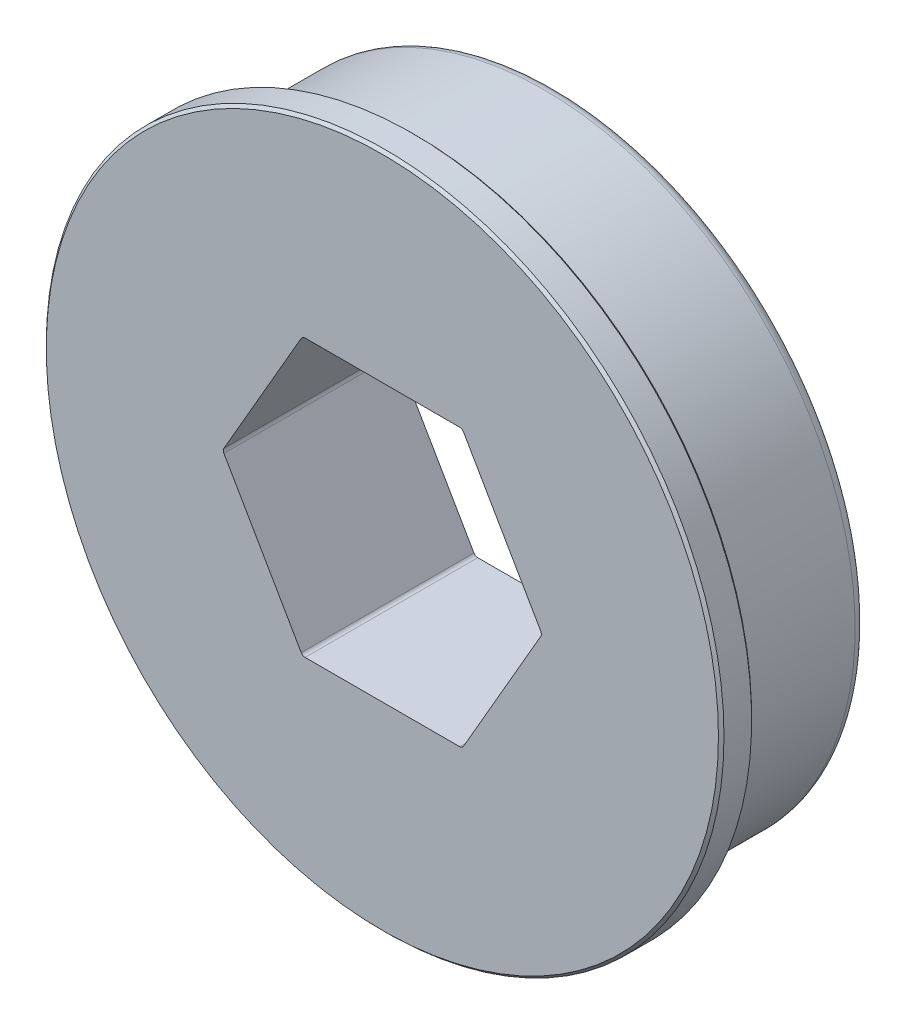
ISO-10303-21;
HEADER;
FILE_DESCRIPTION(('STEP AP214'),'2;1');
FILE_NAME('part.step','',(''),(''),'','','');
FILE_SCHEMA(('AUTOMOTIVE_DESIGN { 1 0 10303 214 1 1 1 1 }'));
ENDSEC;
DATA;
#1=APPLICATION_CONTEXT('core data for automotive mechanical design processes');
#2=APPLICATION_PROTOCOL_DEFINITION('international standard','automotive_design',2000,#1);
#3=PRODUCT_CONTEXT('',#1,'mechanical');
#4=PRODUCT('Part','Part','',(#3));
#5=PRODUCT_RELATED_PRODUCT_CATEGORY('part','',(#4));
#6=PRODUCT_DEFINITION_FORMATION('','',#4);
#7=PRODUCT_DEFINITION_CONTEXT('part definition',#1,'design');
#8=PRODUCT_DEFINITION('design','',#6,#7);
#9=PRODUCT_DEFINITION_SHAPE('','',#8);
#10=(LENGTH_UNIT() NAMED_UNIT(*) SI_UNIT(.MILLI.,.METRE.));
#11=(NAMED_UNIT(*) PLANE_ANGLE_UNIT() SI_UNIT($,.RADIAN.));
#12=(NAMED_UNIT(*) SI_UNIT($,.STERADIAN.) SOLID_ANGLE_UNIT());
#13=UNCERTAINTY_MEASURE_WITH_UNIT(LENGTH_MEASURE(1.E-05),#10,'distance_accuracy_value','');
#14=(GEOMETRIC_REPRESENTATION_CONTEXT(3) GLOBAL_UNCERTAINTY_ASSIGNED_CONTEXT((#13)) GLOBAL_UNIT_ASSIGNED_CONTEXT((#10,
#11,#12)) REPRESENTATION_CONTEXT('',''));
#15=CARTESIAN_POINT('',(0.,0.,0.));
#16=DIRECTION('',(0.,0.,1.));
#17=DIRECTION('',(1.,0.,0.));
#18=AXIS2_PLACEMENT_3D('',#15,#16,#17);
#19=CARTESIAN_POINT('',(0.,0.,7.92734));
#20=DIRECTION('',(0.,0.,-1.));
#21=DIRECTION('',(-1.,0.,0.));
#22=AXIS2_PLACEMENT_3D('',#19,#20,#21);
#23=CYLINDRICAL_SURFACE('',#22,15.5575);
#24=CARTESIAN_POINT('',(0.,0.,7.80034));
#25=DIRECTION('',(0.,0.,1.));
#26=DIRECTION('',(1.,0.,0.));
#27=AXIS2_PLACEMENT_3D('',#24,#25,#26);
#28=CIRCLE('',#27,15.5575);
#29=CARTESIAN_POINT('',(15.5575,0.,7.80034));
#30=VERTEX_POINT('',#29);
#31=EDGE_CURVE('E196',#30,#30,#28,.F.);
#32=ORIENTED_EDGE('',*,*,#31,.T.);
#33=EDGE_LOOP('',(#32));
#34=FACE_BOUND('',#33,.T.);
#35=CARTESIAN_POINT('',(0.,0.,6.53034000000001));
#36=DIRECTION('',(0.,0.,-1.));
#37=DIRECTION('',(-1.,0.,0.));
#38=AXIS2_PLACEMENT_3D('',#35,#36,#37);
#39=CIRCLE('',#38,15.5575);
#40=CARTESIAN_POINT('',(-15.5575,0.,6.53034000000001));
#41=VERTEX_POINT('',#40);
#42=EDGE_CURVE('E193',#41,#41,#39,.F.);
#43=ORIENTED_EDGE('',*,*,#42,.T.);
#44=EDGE_LOOP('',(#43));
#45=FACE_BOUND('',#44,.T.);
#46=ADVANCED_FACE('F46',(#34,#45),#23,.T.);
#47=CARTESIAN_POINT('',(15.5575,0.,7.92734));
#48=DIRECTION('',(0.,0.,1.));
#49=DIRECTION('',(1.,0.,0.));
#50=AXIS2_PLACEMENT_3D('',#47,#48,#49);
#51=PLANE('',#50);
#52=CARTESIAN_POINT('',(0.,0.,7.92734));
#53=DIRECTION('',(0.,0.,1.));
#54=DIRECTION('',(1.,0.,0.));
#55=AXIS2_PLACEMENT_3D('',#52,#53,#54);
#56=CIRCLE('',#55,15.4305);
#57=CARTESIAN_POINT('',(15.4305,0.,7.92734));
#58=VERTEX_POINT('',#57);
#59=EDGE_CURVE('E199',#58,#58,#56,.T.);
#60=ORIENTED_EDGE('',*,*,#59,.T.);
#61=EDGE_LOOP('',(#60));
#62=FACE_BOUND('',#61,.T.);
#63=DIRECTION('',(-0.5,0.866025403784438,0.));
#64=VECTOR('',#63,1.);
#65=CARTESIAN_POINT('',(-3.66617420935411,-6.35000000000001,7.92734));
#66=LINE('',#65,#64);
#67=CARTESIAN_POINT('',(-3.72483299670378,-6.24840000000001,7.92734));
#68=VERTEX_POINT('',#67);
#69=CARTESIAN_POINT('',(-7.27368963135857,-0.101600000000006,7.92734));
#70=VERTEX_POINT('',#69);
#71=EDGE_CURVE('E184',#68,#70,#66,.T.);
#72=ORIENTED_EDGE('',*,*,#71,.T.);
#73=CARTESIAN_POINT('',(-7.09771326930958,0.,7.92734));
#74=DIRECTION('',(0.,0.,1.));
#75=DIRECTION('',(1.,0.,0.));
#76=AXIS2_PLACEMENT_3D('',#73,#74,#75);
#77=CIRCLE('',#76,0.2032);
#78=CARTESIAN_POINT('',(-7.27368963135857,0.101599999999993,7.92734));
#79=VERTEX_POINT('',#78);
#80=EDGE_CURVE('E68',#70,#79,#77,.F.);
#81=ORIENTED_EDGE('',*,*,#80,.T.);
#82=DIRECTION('',(0.5,0.866025403784439,0.));
#83=VECTOR('',#82,1.);
#84=CARTESIAN_POINT('',(-7.33234841870824,0.,7.92734));
#85=LINE('',#84,#83);
#86=CARTESIAN_POINT('',(-3.72483299670379,6.24839999999999,7.92734));
#87=VERTEX_POINT('',#86);
#88=EDGE_CURVE('E179',#79,#87,#85,.T.);
#89=ORIENTED_EDGE('',*,*,#88,.T.);
#90=CARTESIAN_POINT('',(-3.54885663465479,6.14679999999999,7.92734));
#91=DIRECTION('',(0.,0.,1.));
#92=DIRECTION('',(1.,0.,0.));
#93=AXIS2_PLACEMENT_3D('',#90,#91,#92);
#94=CIRCLE('',#93,0.2032);
#95=CARTESIAN_POINT('',(-3.54885663465479,6.34999999999999,7.92734));
#96=VERTEX_POINT('',#95);
#97=EDGE_CURVE('E13',#87,#96,#94,.F.);
#98=ORIENTED_EDGE('',*,*,#97,.T.);
#99=DIRECTION('',(1.,0.,0.));
#100=VECTOR('',#99,1.);
#101=CARTESIAN_POINT('',(-3.66617420935412,6.34999999999999,7.92734));
#102=LINE('',#101,#100);
#103=CARTESIAN_POINT('',(3.5488566346548,6.35,7.92734));
#104=VERTEX_POINT('',#103);
#105=EDGE_CURVE('E252',#96,#104,#102,.T.);
#106=ORIENTED_EDGE('',*,*,#105,.T.);
#107=CARTESIAN_POINT('',(3.5488566346548,6.1468,7.92734));
#108=DIRECTION('',(0.,0.,1.));
#109=DIRECTION('',(1.,0.,0.));
#110=AXIS2_PLACEMENT_3D('',#107,#108,#109);
#111=CIRCLE('',#110,0.2032);
#112=CARTESIAN_POINT('',(3.72483299670379,6.2484,7.92734));
#113=VERTEX_POINT('',#112);
#114=EDGE_CURVE('E146',#104,#113,#111,.F.);
#115=ORIENTED_EDGE('',*,*,#114,.T.);
#116=DIRECTION('',(0.5,-0.866025403784438,0.));
#117=VECTOR('',#116,1.);
#118=CARTESIAN_POINT('',(3.66617420935413,6.35,7.92734));
#119=LINE('',#118,#117);
#120=CARTESIAN_POINT('',(7.27368963135859,0.101599999999997,7.92734));
#121=VERTEX_POINT('',#120);
#122=EDGE_CURVE('E156',#113,#121,#119,.T.);
#123=ORIENTED_EDGE('',*,*,#122,.T.);
#124=CARTESIAN_POINT('',(7.09771326930959,0.,7.92734));
#125=DIRECTION('',(0.,0.,1.));
#126=DIRECTION('',(1.,0.,0.));
#127=AXIS2_PLACEMENT_3D('',#124,#125,#126);
#128=CIRCLE('',#127,0.2032);
#129=CARTESIAN_POINT('',(7.27368963135859,-0.101600000000005,7.92734));
#130=VERTEX_POINT('',#129);
#131=EDGE_CURVE('E232',#121,#130,#128,.F.);
#132=ORIENTED_EDGE('',*,*,#131,.T.);
#133=DIRECTION('',(-0.5,-0.866025403784439,0.));
#134=VECTOR('',#133,1.);
#135=CARTESIAN_POINT('',(7.33234841870825,0.,7.92734));
#136=LINE('',#135,#134);
#137=CARTESIAN_POINT('',(3.7248329967038,-6.24840000000001,7.92734));
#138=VERTEX_POINT('',#137);
#139=EDGE_CURVE('E256',#130,#138,#136,.T.);
#140=ORIENTED_EDGE('',*,*,#139,.T.);
#141=CARTESIAN_POINT('',(3.5488566346548,-6.14680000000001,7.92734));
#142=DIRECTION('',(0.,0.,1.));
#143=DIRECTION('',(1.,0.,0.));
#144=AXIS2_PLACEMENT_3D('',#141,#142,#143);
#145=CIRCLE('',#144,0.2032);
#146=CARTESIAN_POINT('',(3.5488566346548,-6.35000000000001,7.92734));
#147=VERTEX_POINT('',#146);
#148=EDGE_CURVE('E236',#138,#147,#145,.F.);
#149=ORIENTED_EDGE('',*,*,#148,.T.);
#150=DIRECTION('',(-1.,0.,0.));
#151=VECTOR('',#150,1.);
#152=CARTESIAN_POINT('',(3.66617420935413,-6.35000000000001,7.92734));
#153=LINE('',#152,#151);
#154=CARTESIAN_POINT('',(-3.54885663465478,-6.35000000000001,7.92734));
#155=VERTEX_POINT('',#154);
#156=EDGE_CURVE('E262',#147,#155,#153,.T.);
#157=ORIENTED_EDGE('',*,*,#156,.T.);
#158=CARTESIAN_POINT('',(-3.54885663465478,-6.14680000000001,7.92734));
#159=DIRECTION('',(0.,0.,1.));
#160=DIRECTION('',(1.,0.,0.));
#161=AXIS2_PLACEMENT_3D('',#158,#159,#160);
#162=CIRCLE('',#161,0.2032);
#163=EDGE_CURVE('E240',#155,#68,#162,.F.);
#164=ORIENTED_EDGE('',*,*,#163,.T.);
#165=EDGE_LOOP('',(#72,#81,#89,#98,#106,#115,#123,#132,#140,#149,#157,#164));
#166=FACE_BOUND('',#165,.T.);
#167=ADVANCED_FACE('F251',(#62,#166),#51,.T.);
#168=CARTESIAN_POINT('',(0.,0.,0.));
#169=DIRECTION('',(0.,0.,-1.));
#170=DIRECTION('',(-1.,0.,0.));
#171=AXIS2_PLACEMENT_3D('',#168,#169,#170);
#172=PLANE('',#171);
#173=CARTESIAN_POINT('',(0.,0.,0.));
#174=DIRECTION('',(0.,0.,-1.));
#175=DIRECTION('',(-1.,0.,0.));
#176=AXIS2_PLACEMENT_3D('',#173,#174,#175);
#177=CIRCLE('',#176,13.7795);
#178=CARTESIAN_POINT('',(-13.7795,0.,0.));
#179=VERTEX_POINT('',#178);
#180=EDGE_CURVE('E202',#179,#179,#177,.T.);
#181=ORIENTED_EDGE('',*,*,#180,.T.);
#182=EDGE_LOOP('',(#181));
#183=FACE_BOUND('',#182,.T.);
#184=DIRECTION('',(0.5,0.866025403784439,0.));
#185=VECTOR('',#184,1.);
#186=CARTESIAN_POINT('',(-7.33234841870824,0.,0.));
#187=LINE('',#186,#185);
#188=CARTESIAN_POINT('',(-7.27368963135857,0.101599999999993,0.));
#189=VERTEX_POINT('',#188);
#190=CARTESIAN_POINT('',(-3.72483299670379,6.24839999999999,0.));
#191=VERTEX_POINT('',#190);
#192=EDGE_CURVE('E170',#189,#191,#187,.T.);
#193=ORIENTED_EDGE('',*,*,#192,.F.);
#194=CARTESIAN_POINT('',(-7.09771326930958,0.,0.));
#195=DIRECTION('',(0.,0.,-1.));
#196=DIRECTION('',(-1.,0.,0.));
#197=AXIS2_PLACEMENT_3D('',#194,#195,#196);
#198=CIRCLE('',#197,0.2032);
#199=CARTESIAN_POINT('',(-7.27368963135857,-0.101600000000006,0.));
#200=VERTEX_POINT('',#199);
#201=EDGE_CURVE('E242',#189,#200,#198,.F.);
#202=ORIENTED_EDGE('',*,*,#201,.T.);
#203=DIRECTION('',(-0.5,0.866025403784438,0.));
#204=VECTOR('',#203,1.);
#205=CARTESIAN_POINT('',(-3.66617420935411,-6.35000000000001,0.));
#206=LINE('',#205,#204);
#207=CARTESIAN_POINT('',(-3.72483299670378,-6.24840000000001,0.));
#208=VERTEX_POINT('',#207);
#209=EDGE_CURVE('E176',#208,#200,#206,.T.);
#210=ORIENTED_EDGE('',*,*,#209,.F.);
#211=CARTESIAN_POINT('',(-3.54885663465478,-6.14680000000001,0.));
#212=DIRECTION('',(0.,0.,-1.));
#213=DIRECTION('',(-1.,0.,0.));
#214=AXIS2_PLACEMENT_3D('',#211,#212,#213);
#215=CIRCLE('',#214,0.2032);
#216=CARTESIAN_POINT('',(-3.54885663465478,-6.35000000000001,0.));
#217=VERTEX_POINT('',#216);
#218=EDGE_CURVE('E238',#208,#217,#215,.F.);
#219=ORIENTED_EDGE('',*,*,#218,.T.);
#220=DIRECTION('',(-1.,0.,0.));
#221=VECTOR('',#220,1.);
#222=CARTESIAN_POINT('',(3.66617420935413,-6.35000000000001,0.));
#223=LINE('',#222,#221);
#224=CARTESIAN_POINT('',(3.5488566346548,-6.35000000000001,0.));
#225=VERTEX_POINT('',#224);
#226=EDGE_CURVE('E168',#225,#217,#223,.T.);
#227=ORIENTED_EDGE('',*,*,#226,.F.);
#228=CARTESIAN_POINT('',(3.5488566346548,-6.14680000000001,0.));
#229=DIRECTION('',(0.,0.,-1.));
#230=DIRECTION('',(-1.,0.,0.));
#231=AXIS2_PLACEMENT_3D('',#228,#229,#230);
#232=CIRCLE('',#231,0.2032);
#233=CARTESIAN_POINT('',(3.7248329967038,-6.24840000000001,0.));
#234=VERTEX_POINT('',#233);
#235=EDGE_CURVE('E234',#225,#234,#232,.F.);
#236=ORIENTED_EDGE('',*,*,#235,.T.);
#237=DIRECTION('',(-0.5,-0.866025403784439,0.));
#238=VECTOR('',#237,1.);
#239=CARTESIAN_POINT('',(7.33234841870825,0.,0.));
#240=LINE('',#239,#238);
#241=CARTESIAN_POINT('',(7.27368963135859,-0.101600000000005,0.));
#242=VERTEX_POINT('',#241);
#243=EDGE_CURVE('E164',#242,#234,#240,.T.);
#244=ORIENTED_EDGE('',*,*,#243,.F.);
#245=CARTESIAN_POINT('',(7.09771326930959,0.,0.));
#246=DIRECTION('',(0.,0.,-1.));
#247=DIRECTION('',(-1.,0.,0.));
#248=AXIS2_PLACEMENT_3D('',#245,#246,#247);
#249=CIRCLE('',#248,0.2032);
#250=CARTESIAN_POINT('',(7.27368963135859,0.101599999999997,0.));
#251=VERTEX_POINT('',#250);
#252=EDGE_CURVE('E163',#242,#251,#249,.F.);
#253=ORIENTED_EDGE('',*,*,#252,.T.);
#254=DIRECTION('',(0.5,-0.866025403784438,0.));
#255=VECTOR('',#254,1.);
#256=CARTESIAN_POINT('',(3.66617420935413,6.35,0.));
#257=LINE('',#256,#255);
#258=CARTESIAN_POINT('',(3.72483299670379,6.2484,0.));
#259=VERTEX_POINT('',#258);
#260=EDGE_CURVE('E153',#259,#251,#257,.T.);
#261=ORIENTED_EDGE('',*,*,#260,.F.);
#262=CARTESIAN_POINT('',(3.5488566346548,6.1468,0.));
#263=DIRECTION('',(0.,0.,-1.));
#264=DIRECTION('',(-1.,0.,0.));
#265=AXIS2_PLACEMENT_3D('',#262,#263,#264);
#266=CIRCLE('',#265,0.2032);
#267=CARTESIAN_POINT('',(3.5488566346548,6.35,0.));
#268=VERTEX_POINT('',#267);
#269=EDGE_CURVE('E136',#259,#268,#266,.F.);
#270=ORIENTED_EDGE('',*,*,#269,.T.);
#271=DIRECTION('',(1.,0.,0.));
#272=VECTOR('',#271,1.);
#273=CARTESIAN_POINT('',(-3.66617420935412,6.34999999999999,0.));
#274=LINE('',#273,#272);
#275=CARTESIAN_POINT('',(-3.54885663465479,6.34999999999999,0.));
#276=VERTEX_POINT('',#275);
#277=EDGE_CURVE('E165',#276,#268,#274,.T.);
#278=ORIENTED_EDGE('',*,*,#277,.F.);
#279=CARTESIAN_POINT('',(-3.54885663465479,6.14679999999999,0.));
#280=DIRECTION('',(0.,0.,-1.));
#281=DIRECTION('',(-1.,0.,0.));
#282=AXIS2_PLACEMENT_3D('',#279,#280,#281);
#283=CIRCLE('',#282,0.2032);
#284=EDGE_CURVE('E54',#276,#191,#283,.F.);
#285=ORIENTED_EDGE('',*,*,#284,.T.);
#286=EDGE_LOOP('',(#193,#202,#210,#219,#227,#236,#244,#253,#261,#270,#278,#285));
#287=FACE_BOUND('',#286,.T.);
#288=ADVANCED_FACE('F161',(#183,#287),#172,.T.);
#289=CARTESIAN_POINT('',(0.,0.,7.92734));
#290=DIRECTION('',(0.,0.,-1.));
#291=DIRECTION('',(-1.,0.,0.));
#292=AXIS2_PLACEMENT_3D('',#289,#290,#291);
#293=CYLINDRICAL_SURFACE('',#292,14.2875);
#294=CARTESIAN_POINT('',(0.,0.,0.508));
#295=DIRECTION('',(0.,0.,-1.));
#296=DIRECTION('',(-1.,0.,0.));
#297=AXIS2_PLACEMENT_3D('',#294,#295,#296);
#298=CIRCLE('',#297,14.2875);
#299=CARTESIAN_POINT('',(-14.2875,0.,0.508));
#300=VERTEX_POINT('',#299);
#301=EDGE_CURVE('E205',#300,#300,#298,.F.);
#302=ORIENTED_EDGE('',*,*,#301,.T.);
#303=EDGE_LOOP('',(#302));
#304=FACE_BOUND('',#303,.T.);
#305=CARTESIAN_POINT('',(0.,0.,5.89534));
#306=DIRECTION('',(0.,0.,-1.));
#307=DIRECTION('',(-1.,0.,0.));
#308=AXIS2_PLACEMENT_3D('',#305,#306,#307);
#309=CIRCLE('',#308,14.2875);
#310=CARTESIAN_POINT('',(-14.2875,0.,5.89534));
#311=VERTEX_POINT('',#310);
#312=EDGE_CURVE('E187',#311,#311,#309,.T.);
#313=ORIENTED_EDGE('',*,*,#312,.T.);
#314=EDGE_LOOP('',(#313));
#315=FACE_BOUND('',#314,.T.);
#316=ADVANCED_FACE('F330',(#304,#315),#293,.T.);
#317=CARTESIAN_POINT('',(14.2875,0.,5.89534));
#318=DIRECTION('',(0.,0.,1.));
#319=DIRECTION('',(1.,0.,0.));
#320=AXIS2_PLACEMENT_3D('',#317,#318,#319);
#321=PLANE('',#320);
#322=CARTESIAN_POINT('',(0.,0.,5.89534));
#323=DIRECTION('',(0.,0.,-1.));
#324=DIRECTION('',(-1.,0.,0.));
#325=AXIS2_PLACEMENT_3D('',#322,#323,#324);
#326=CIRCLE('',#325,13.97);
#327=CARTESIAN_POINT('',(-13.97,0.,5.89534));
#328=VERTEX_POINT('',#327);
#329=EDGE_CURVE('E183',#328,#328,#326,.T.);
#330=ORIENTED_EDGE('',*,*,#329,.T.);
#331=EDGE_LOOP('',(#330));
#332=FACE_BOUND('',#331,.T.);
#333=ORIENTED_EDGE('',*,*,#312,.F.);
#334=EDGE_LOOP('',(#333));
#335=FACE_BOUND('',#334,.T.);
#336=ADVANCED_FACE('F334',(#332,#335),#321,.T.);
#337=CARTESIAN_POINT('',(0.,0.,7.92734));
#338=DIRECTION('',(0.,0.,-1.));
#339=DIRECTION('',(-1.,0.,0.));
#340=AXIS2_PLACEMENT_3D('',#337,#338,#339);
#341=CYLINDRICAL_SURFACE('',#340,13.97);
#342=CARTESIAN_POINT('',(0.,0.,6.40333999999999));
#343=DIRECTION('',(0.,0.,-1.));
#344=DIRECTION('',(-1.,0.,0.));
#345=AXIS2_PLACEMENT_3D('',#342,#343,#344);
#346=CIRCLE('',#345,13.97);
#347=CARTESIAN_POINT('',(-13.97,0.,6.40333999999999));
#348=VERTEX_POINT('',#347);
#349=EDGE_CURVE('E180',#348,#348,#346,.T.);
#350=ORIENTED_EDGE('',*,*,#349,.T.);
#351=EDGE_LOOP('',(#350));
#352=FACE_BOUND('',#351,.T.);
#353=ORIENTED_EDGE('',*,*,#329,.F.);
#354=EDGE_LOOP('',(#353));
#355=FACE_BOUND('',#354,.T.);
#356=ADVANCED_FACE('F340',(#352,#355),#341,.T.);
#357=CARTESIAN_POINT('',(13.97,0.,6.40334));
#358=DIRECTION('',(0.,0.,-1.));
#359=DIRECTION('',(-1.,0.,0.));
#360=AXIS2_PLACEMENT_3D('',#357,#358,#359);
#361=PLANE('',#360);
#362=CARTESIAN_POINT('',(0.,0.,6.40334));
#363=DIRECTION('',(0.,0.,-1.));
#364=DIRECTION('',(-1.,0.,0.));
#365=AXIS2_PLACEMENT_3D('',#362,#363,#364);
#366=CIRCLE('',#365,15.4305);
#367=CARTESIAN_POINT('',(-15.4305,0.,6.40334));
#368=VERTEX_POINT('',#367);
#369=EDGE_CURVE('E190',#368,#368,#366,.T.);
#370=ORIENTED_EDGE('',*,*,#369,.T.);
#371=EDGE_LOOP('',(#370));
#372=FACE_BOUND('',#371,.T.);
#373=ORIENTED_EDGE('',*,*,#349,.F.);
#374=EDGE_LOOP('',(#373));
#375=FACE_BOUND('',#374,.T.);
#376=ADVANCED_FACE('F344',(#372,#375),#361,.T.);
#377=CARTESIAN_POINT('',(-7.33234841870824,0.,7.92734));
#378=DIRECTION('',(-0.866025403784439,0.5,0.));
#379=DIRECTION('',(-0.5,-0.866025403784439,0.));
#380=AXIS2_PLACEMENT_3D('',#377,#378,#379);
#381=PLANE('',#380);
#382=ORIENTED_EDGE('',*,*,#88,.F.);
#383=DIRECTION('',(0.,0.,-1.));
#384=VECTOR('',#383,1.);
#385=CARTESIAN_POINT('',(-7.27368963135857,0.101599999999994,0.));
#386=LINE('',#385,#384);
#387=EDGE_CURVE('E147',#79,#189,#386,.T.);
#388=ORIENTED_EDGE('',*,*,#387,.T.);
#389=ORIENTED_EDGE('',*,*,#192,.T.);
#390=DIRECTION('',(0.,0.,-1.));
#391=VECTOR('',#390,1.);
#392=CARTESIAN_POINT('',(-3.72483299670378,6.24839999999999,7.92734));
#393=LINE('',#392,#391);
#394=EDGE_CURVE('E61',#191,#87,#393,.F.);
#395=ORIENTED_EDGE('',*,*,#394,.T.);
#396=EDGE_LOOP('',(#382,#388,#389,#395));
#397=FACE_BOUND('',#396,.T.);
#398=ADVANCED_FACE('F246',(#397),#381,.F.);
#399=CARTESIAN_POINT('',(-3.66617420935411,-6.35000000000001,7.92734));
#400=DIRECTION('',(-0.866025403784438,-0.5,0.));
#401=DIRECTION('',(0.5,-0.866025403784439,0.));
#402=AXIS2_PLACEMENT_3D('',#399,#400,#401);
#403=PLANE('',#402);
#404=ORIENTED_EDGE('',*,*,#71,.F.);
#405=DIRECTION('',(0.,0.,-1.));
#406=VECTOR('',#405,1.);
#407=CARTESIAN_POINT('',(-3.72483299670378,-6.24840000000001,0.));
#408=LINE('',#407,#406);
#409=EDGE_CURVE('E224',#68,#208,#408,.T.);
#410=ORIENTED_EDGE('',*,*,#409,.T.);
#411=ORIENTED_EDGE('',*,*,#209,.T.);
#412=DIRECTION('',(0.,0.,-1.));
#413=VECTOR('',#412,1.);
#414=CARTESIAN_POINT('',(-7.27368963135857,-0.101600000000006,7.92734));
#415=LINE('',#414,#413);
#416=EDGE_CURVE('E222',#200,#70,#415,.F.);
#417=ORIENTED_EDGE('',*,*,#416,.T.);
#418=EDGE_LOOP('',(#404,#410,#411,#417));
#419=FACE_BOUND('',#418,.T.);
#420=ADVANCED_FACE('F273',(#419),#403,.F.);
#421=CARTESIAN_POINT('',(3.66617420935413,-6.35000000000001,7.92734));
#422=DIRECTION('',(0.,-1.,0.));
#423=DIRECTION('',(0.,0.,-1.));
#424=AXIS2_PLACEMENT_3D('',#421,#422,#423);
#425=PLANE('',#424);
#426=ORIENTED_EDGE('',*,*,#156,.F.);
#427=DIRECTION('',(0.,0.,-1.));
#428=VECTOR('',#427,1.);
#429=CARTESIAN_POINT('',(3.5488566346548,-6.35000000000001,0.));
#430=LINE('',#429,#428);
#431=EDGE_CURVE('E219',#147,#225,#430,.T.);
#432=ORIENTED_EDGE('',*,*,#431,.T.);
#433=ORIENTED_EDGE('',*,*,#226,.T.);
#434=DIRECTION('',(0.,0.,-1.));
#435=VECTOR('',#434,1.);
#436=CARTESIAN_POINT('',(-3.54885663465478,-6.35000000000001,7.92734));
#437=LINE('',#436,#435);
#438=EDGE_CURVE('E217',#217,#155,#437,.F.);
#439=ORIENTED_EDGE('',*,*,#438,.T.);
#440=EDGE_LOOP('',(#426,#432,#433,#439));
#441=FACE_BOUND('',#440,.T.);
#442=ADVANCED_FACE('F280',(#441),#425,.F.);
#443=CARTESIAN_POINT('',(7.33234841870825,0.,7.92734));
#444=DIRECTION('',(0.866025403784439,-0.5,0.));
#445=DIRECTION('',(0.5,0.866025403784439,0.));
#446=AXIS2_PLACEMENT_3D('',#443,#444,#445);
#447=PLANE('',#446);
#448=ORIENTED_EDGE('',*,*,#139,.F.);
#449=DIRECTION('',(0.,0.,-1.));
#450=VECTOR('',#449,1.);
#451=CARTESIAN_POINT('',(7.27368963135859,-0.101600000000005,0.));
#452=LINE('',#451,#450);
#453=EDGE_CURVE('E214',#130,#242,#452,.T.);
#454=ORIENTED_EDGE('',*,*,#453,.T.);
#455=ORIENTED_EDGE('',*,*,#243,.T.);
#456=DIRECTION('',(0.,0.,-1.));
#457=VECTOR('',#456,1.);
#458=CARTESIAN_POINT('',(3.7248329967038,-6.24840000000001,7.92734));
#459=LINE('',#458,#457);
#460=EDGE_CURVE('E212',#234,#138,#459,.F.);
#461=ORIENTED_EDGE('',*,*,#460,.T.);
#462=EDGE_LOOP('',(#448,#454,#455,#461));
#463=FACE_BOUND('',#462,.T.);
#464=ADVANCED_FACE('F288',(#463),#447,.F.);
#465=CARTESIAN_POINT('',(3.66617420935413,6.35,7.92734));
#466=DIRECTION('',(0.866025403784439,0.5,0.));
#467=DIRECTION('',(-0.5,0.866025403784439,0.));
#468=AXIS2_PLACEMENT_3D('',#465,#466,#467);
#469=PLANE('',#468);
#470=ORIENTED_EDGE('',*,*,#122,.F.);
#471=DIRECTION('',(0.,0.,-1.));
#472=VECTOR('',#471,1.);
#473=CARTESIAN_POINT('',(3.72483299670379,6.2484,0.));
#474=LINE('',#473,#472);
#475=EDGE_CURVE('E140',#113,#259,#474,.T.);
#476=ORIENTED_EDGE('',*,*,#475,.T.);
#477=ORIENTED_EDGE('',*,*,#260,.T.);
#478=DIRECTION('',(0.,0.,-1.));
#479=VECTOR('',#478,1.);
#480=CARTESIAN_POINT('',(7.27368963135859,0.101599999999995,7.92734));
#481=LINE('',#480,#479);
#482=EDGE_CURVE('E158',#251,#121,#481,.F.);
#483=ORIENTED_EDGE('',*,*,#482,.T.);
#484=EDGE_LOOP('',(#470,#476,#477,#483));
#485=FACE_BOUND('',#484,.T.);
#486=ADVANCED_FACE('F152',(#485),#469,.F.);
#487=CARTESIAN_POINT('',(-3.66617420935412,6.34999999999999,7.92734));
#488=DIRECTION('',(0.,1.,0.));
#489=DIRECTION('',(-1.,0.,0.));
#490=AXIS2_PLACEMENT_3D('',#487,#488,#489);
#491=PLANE('',#490);
#492=ORIENTED_EDGE('',*,*,#277,.T.);
#493=DIRECTION('',(0.,0.,-1.));
#494=VECTOR('',#493,1.);
#495=CARTESIAN_POINT('',(3.5488566346548,6.35,7.92734));
#496=LINE('',#495,#494);
#497=EDGE_CURVE('E141',#268,#104,#496,.F.);
#498=ORIENTED_EDGE('',*,*,#497,.T.);
#499=ORIENTED_EDGE('',*,*,#105,.F.);
#500=DIRECTION('',(0.,0.,-1.));
#501=VECTOR('',#500,1.);
#502=CARTESIAN_POINT('',(-3.54885663465479,6.34999999999999,0.));
#503=LINE('',#502,#501);
#504=EDGE_CURVE('E157',#96,#276,#503,.T.);
#505=ORIENTED_EDGE('',*,*,#504,.T.);
#506=EDGE_LOOP('',(#492,#498,#499,#505));
#507=FACE_BOUND('',#506,.T.);
#508=ADVANCED_FACE('F254',(#507),#491,.F.);
#509=CARTESIAN_POINT('',(0.,0.,6.40334));
#510=DIRECTION('',(0.,0.,1.));
#511=DIRECTION('',(1.,0.,0.));
#512=AXIS2_PLACEMENT_3D('',#509,#510,#511);
#513=CONICAL_SURFACE('',#512,15.4305,0.785398163397469);
#514=ORIENTED_EDGE('',*,*,#42,.F.);
#515=EDGE_LOOP('',(#514));
#516=FACE_BOUND('',#515,.T.);
#517=ORIENTED_EDGE('',*,*,#369,.F.);
#518=EDGE_LOOP('',(#517));
#519=FACE_BOUND('',#518,.T.);
#520=ADVANCED_FACE('F313',(#516,#519),#513,.T.);
#521=CARTESIAN_POINT('',(0.,0.,7.80034));
#522=DIRECTION('',(0.,0.,-1.));
#523=DIRECTION('',(-1.,0.,0.));
#524=AXIS2_PLACEMENT_3D('',#521,#522,#523);
#525=CONICAL_SURFACE('',#524,15.5575,0.785398163397442);
#526=ORIENTED_EDGE('',*,*,#59,.F.);
#527=EDGE_LOOP('',(#526));
#528=FACE_BOUND('',#527,.T.);
#529=ORIENTED_EDGE('',*,*,#31,.F.);
#530=EDGE_LOOP('',(#529));
#531=FACE_BOUND('',#530,.T.);
#532=ADVANCED_FACE('F316',(#528,#531),#525,.T.);
#533=CARTESIAN_POINT('',(0.,0.,0.508));
#534=DIRECTION('',(0.,0.,-1.));
#535=DIRECTION('',(-1.,0.,0.));
#536=AXIS2_PLACEMENT_3D('',#533,#534,#535);
#537=TOROIDAL_SURFACE('',#536,13.7795,0.508);
#538=ORIENTED_EDGE('',*,*,#301,.F.);
#539=EDGE_LOOP('',(#538));
#540=FACE_BOUND('',#539,.T.);
#541=ORIENTED_EDGE('',*,*,#180,.F.);
#542=EDGE_LOOP('',(#541));
#543=FACE_BOUND('',#542,.T.);
#544=ADVANCED_FACE('F300',(#540,#543),#537,.T.);
#545=CARTESIAN_POINT('',(3.5488566346548,6.1468,7.92734));
#546=DIRECTION('',(0.,0.,1.));
#547=DIRECTION('',(1.,0.,0.));
#548=AXIS2_PLACEMENT_3D('',#545,#546,#547);
#549=CYLINDRICAL_SURFACE('',#548,0.2032);
#550=ORIENTED_EDGE('',*,*,#114,.F.);
#551=ORIENTED_EDGE('',*,*,#497,.F.);
#552=ORIENTED_EDGE('',*,*,#269,.F.);
#553=ORIENTED_EDGE('',*,*,#475,.F.);
#554=EDGE_LOOP('',(#550,#551,#552,#553));
#555=FACE_BOUND('',#554,.T.);
#556=ADVANCED_FACE('F139',(#555),#549,.F.);
#557=CARTESIAN_POINT('',(7.09771326930959,0.,7.92734));
#558=DIRECTION('',(0.,0.,1.));
#559=DIRECTION('',(1.,0.,0.));
#560=AXIS2_PLACEMENT_3D('',#557,#558,#559);
#561=CYLINDRICAL_SURFACE('',#560,0.2032);
#562=ORIENTED_EDGE('',*,*,#131,.F.);
#563=ORIENTED_EDGE('',*,*,#482,.F.);
#564=ORIENTED_EDGE('',*,*,#252,.F.);
#565=ORIENTED_EDGE('',*,*,#453,.F.);
#566=EDGE_LOOP('',(#562,#563,#564,#565));
#567=FACE_BOUND('',#566,.T.);
#568=ADVANCED_FACE('F292',(#567),#561,.F.);
#569=CARTESIAN_POINT('',(3.5488566346548,-6.14680000000001,7.92734));
#570=DIRECTION('',(0.,0.,1.));
#571=DIRECTION('',(1.,0.,0.));
#572=AXIS2_PLACEMENT_3D('',#569,#570,#571);
#573=CYLINDRICAL_SURFACE('',#572,0.2032);
#574=ORIENTED_EDGE('',*,*,#148,.F.);
#575=ORIENTED_EDGE('',*,*,#460,.F.);
#576=ORIENTED_EDGE('',*,*,#235,.F.);
#577=ORIENTED_EDGE('',*,*,#431,.F.);
#578=EDGE_LOOP('',(#574,#575,#576,#577));
#579=FACE_BOUND('',#578,.T.);
#580=ADVANCED_FACE('F284',(#579),#573,.F.);
#581=CARTESIAN_POINT('',(-3.54885663465478,-6.14680000000001,7.92734));
#582=DIRECTION('',(0.,0.,1.));
#583=DIRECTION('',(1.,0.,0.));
#584=AXIS2_PLACEMENT_3D('',#581,#582,#583);
#585=CYLINDRICAL_SURFACE('',#584,0.2032);
#586=ORIENTED_EDGE('',*,*,#163,.F.);
#587=ORIENTED_EDGE('',*,*,#438,.F.);
#588=ORIENTED_EDGE('',*,*,#218,.F.);
#589=ORIENTED_EDGE('',*,*,#409,.F.);
#590=EDGE_LOOP('',(#586,#587,#588,#589));
#591=FACE_BOUND('',#590,.T.);
#592=ADVANCED_FACE('F275',(#591),#585,.F.);
#593=CARTESIAN_POINT('',(-7.09771326930958,0.,7.92734));
#594=DIRECTION('',(0.,0.,1.));
#595=DIRECTION('',(1.,0.,0.));
#596=AXIS2_PLACEMENT_3D('',#593,#594,#595);
#597=CYLINDRICAL_SURFACE('',#596,0.2032);
#598=ORIENTED_EDGE('',*,*,#80,.F.);
#599=ORIENTED_EDGE('',*,*,#416,.F.);
#600=ORIENTED_EDGE('',*,*,#201,.F.);
#601=ORIENTED_EDGE('',*,*,#387,.F.);
#602=EDGE_LOOP('',(#598,#599,#600,#601));
#603=FACE_BOUND('',#602,.T.);
#604=ADVANCED_FACE('F271',(#603),#597,.F.);
#605=CARTESIAN_POINT('',(-3.54885663465479,6.14679999999999,7.92734));
#606=DIRECTION('',(0.,0.,1.));
#607=DIRECTION('',(1.,0.,0.));
#608=AXIS2_PLACEMENT_3D('',#605,#606,#607);
#609=CYLINDRICAL_SURFACE('',#608,0.2032);
#610=ORIENTED_EDGE('',*,*,#97,.F.);
#611=ORIENTED_EDGE('',*,*,#394,.F.);
#612=ORIENTED_EDGE('',*,*,#284,.F.);
#613=ORIENTED_EDGE('',*,*,#504,.F.);
#614=EDGE_LOOP('',(#610,#611,#612,#613));
#615=FACE_BOUND('',#614,.T.);
#616=ADVANCED_FACE('F48',(#615),#609,.F.);
#617=CLOSED_SHELL('',(#46,#167,#288,#316,#336,#356,#376,#398,#420,#442,#464,#486,#508,#520,#532,
#544,#556,#568,#580,#592,#604,#616));
#618=MANIFOLD_SOLID_BREP('B2',#617);
#619=ADVANCED_BREP_SHAPE_REPRESENTATION('',(#18,#618),#14);
#620=SHAPE_DEFINITION_REPRESENTATION(#9,#619);
ENDSEC;
END-ISO-10303-21;
